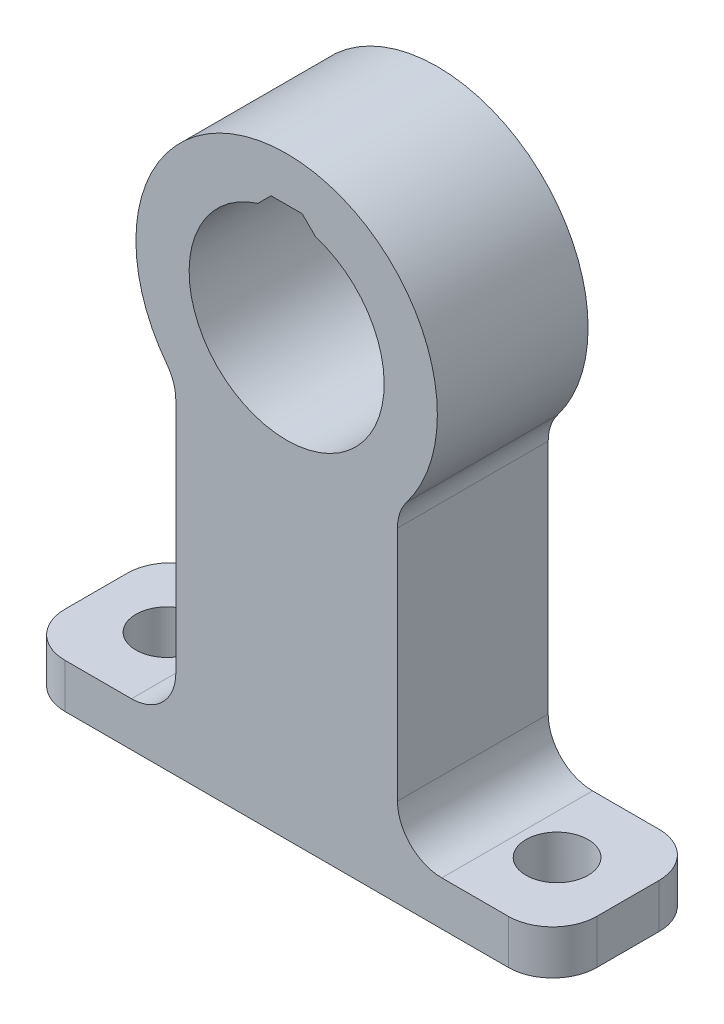
ISO-10303-21;
HEADER;
FILE_DESCRIPTION(('STEP AP214'),'2;1');
FILE_NAME('part.step','',(''),(''),'','','');
FILE_SCHEMA(('AUTOMOTIVE_DESIGN { 1 0 10303 214 1 1 1 1 }'));
ENDSEC;
DATA;
#1=APPLICATION_CONTEXT('core data for automotive mechanical design processes');
#2=APPLICATION_PROTOCOL_DEFINITION('international standard','automotive_design',2000,#1);
#3=PRODUCT_CONTEXT('',#1,'mechanical');
#4=PRODUCT('Part','Part','',(#3));
#5=PRODUCT_RELATED_PRODUCT_CATEGORY('part','',(#4));
#6=PRODUCT_DEFINITION_FORMATION('','',#4);
#7=PRODUCT_DEFINITION_CONTEXT('part definition',#1,'design');
#8=PRODUCT_DEFINITION('design','',#6,#7);
#9=PRODUCT_DEFINITION_SHAPE('','',#8);
#10=(LENGTH_UNIT() NAMED_UNIT(*) SI_UNIT(.MILLI.,.METRE.));
#11=(NAMED_UNIT(*) PLANE_ANGLE_UNIT() SI_UNIT($,.RADIAN.));
#12=(NAMED_UNIT(*) SI_UNIT($,.STERADIAN.) SOLID_ANGLE_UNIT());
#13=UNCERTAINTY_MEASURE_WITH_UNIT(LENGTH_MEASURE(1.E-05),#10,'distance_accuracy_value','');
#14=(GEOMETRIC_REPRESENTATION_CONTEXT(3) GLOBAL_UNCERTAINTY_ASSIGNED_CONTEXT((#13)) GLOBAL_UNIT_ASSIGNED_CONTEXT((#10,
#11,#12)) REPRESENTATION_CONTEXT('',''));
#15=CARTESIAN_POINT('',(0.,0.,0.));
#16=DIRECTION('',(0.,0.,1.));
#17=DIRECTION('',(1.,0.,0.));
#18=AXIS2_PLACEMENT_3D('',#15,#16,#17);
#19=CARTESIAN_POINT('',(0.,0.,17.));
#20=DIRECTION('',(0.,0.,1.));
#21=DIRECTION('',(1.,0.,0.));
#22=AXIS2_PLACEMENT_3D('',#19,#20,#21);
#23=PLANE('',#22);
#24=DIRECTION('',(1.,0.,0.));
#25=VECTOR('',#24,1.);
#26=CARTESIAN_POINT('',(30.,-50.,17.));
#27=LINE('',#26,#25);
#28=CARTESIAN_POINT('',(-25.,-50.,17.));
#29=VERTEX_POINT('',#28);
#30=CARTESIAN_POINT('',(25.,-50.,17.));
#31=VERTEX_POINT('',#30);
#32=EDGE_CURVE('E261',#29,#31,#27,.T.);
#33=ORIENTED_EDGE('',*,*,#32,.T.);
#34=DIRECTION('',(0.,1.,0.));
#35=VECTOR('',#34,1.);
#36=CARTESIAN_POINT('',(25.,-45.,17.));
#37=LINE('',#36,#35);
#38=CARTESIAN_POINT('',(25.,-45.,17.));
#39=VERTEX_POINT('',#38);
#40=EDGE_CURVE('E375',#31,#39,#37,.T.);
#41=ORIENTED_EDGE('',*,*,#40,.T.);
#42=DIRECTION('',(-1.,0.,0.));
#43=VECTOR('',#42,1.);
#44=CARTESIAN_POINT('',(12.5,-45.,17.));
#45=LINE('',#44,#43);
#46=CARTESIAN_POINT('',(17.5,-45.,17.));
#47=VERTEX_POINT('',#46);
#48=EDGE_CURVE('E240',#39,#47,#45,.T.);
#49=ORIENTED_EDGE('',*,*,#48,.T.);
#50=CARTESIAN_POINT('',(17.5,-40.,17.));
#51=DIRECTION('',(0.,0.,1.));
#52=DIRECTION('',(1.,0.,0.));
#53=AXIS2_PLACEMENT_3D('',#50,#51,#52);
#54=CIRCLE('',#53,5.);
#55=CARTESIAN_POINT('',(12.5,-40.,17.));
#56=VERTEX_POINT('',#55);
#57=EDGE_CURVE('E11',#47,#56,#54,.F.);
#58=ORIENTED_EDGE('',*,*,#57,.T.);
#59=DIRECTION('',(0.,1.,0.));
#60=VECTOR('',#59,1.);
#61=CARTESIAN_POINT('',(12.5,-11.5217186218029,17.));
#62=LINE('',#61,#60);
#63=CARTESIAN_POINT('',(12.5,-13.3322916259734,17.));
#64=VERTEX_POINT('',#63);
#65=EDGE_CURVE('E244',#56,#64,#62,.T.);
#66=ORIENTED_EDGE('',*,*,#65,.T.);
#67=CARTESIAN_POINT('',(17.5,-13.3322916259734,17.));
#68=DIRECTION('',(0.,0.,1.));
#69=DIRECTION('',(1.,0.,0.));
#70=AXIS2_PLACEMENT_3D('',#67,#68,#69);
#71=CIRCLE('',#70,5.);
#72=CARTESIAN_POINT('',(13.5227272727273,-10.3022253473431,17.));
#73=VERTEX_POINT('',#72);
#74=EDGE_CURVE('E382',#64,#73,#71,.F.);
#75=ORIENTED_EDGE('',*,*,#74,.T.);
#76=CARTESIAN_POINT('',(0.,0.,17.));
#77=DIRECTION('',(0.,0.,1.));
#78=DIRECTION('',(1.,0.,0.));
#79=AXIS2_PLACEMENT_3D('',#76,#77,#78);
#80=CIRCLE('',#79,17.);
#81=CARTESIAN_POINT('',(-13.5227272727273,-10.3022253473431,17.));
#82=VERTEX_POINT('',#81);
#83=EDGE_CURVE('E249',#73,#82,#80,.T.);
#84=ORIENTED_EDGE('',*,*,#83,.T.);
#85=CARTESIAN_POINT('',(-17.5,-13.3322916259734,17.));
#86=DIRECTION('',(0.,0.,1.));
#87=DIRECTION('',(1.,0.,0.));
#88=AXIS2_PLACEMENT_3D('',#85,#86,#87);
#89=CIRCLE('',#88,5.);
#90=CARTESIAN_POINT('',(-12.5,-13.3322916259734,17.));
#91=VERTEX_POINT('',#90);
#92=EDGE_CURVE('E388',#82,#91,#89,.F.);
#93=ORIENTED_EDGE('',*,*,#92,.T.);
#94=DIRECTION('',(0.,-1.,0.));
#95=VECTOR('',#94,1.);
#96=CARTESIAN_POINT('',(-12.5,-11.5217186218029,17.));
#97=LINE('',#96,#95);
#98=CARTESIAN_POINT('',(-12.5,-40.,17.));
#99=VERTEX_POINT('',#98);
#100=EDGE_CURVE('E253',#91,#99,#97,.T.);
#101=ORIENTED_EDGE('',*,*,#100,.T.);
#102=CARTESIAN_POINT('',(-17.5,-40.,17.));
#103=DIRECTION('',(0.,0.,1.));
#104=DIRECTION('',(1.,0.,0.));
#105=AXIS2_PLACEMENT_3D('',#102,#103,#104);
#106=CIRCLE('',#105,5.);
#107=CARTESIAN_POINT('',(-17.5,-45.,17.));
#108=VERTEX_POINT('',#107);
#109=EDGE_CURVE('E394',#99,#108,#106,.F.);
#110=ORIENTED_EDGE('',*,*,#109,.T.);
#111=DIRECTION('',(-1.,0.,0.));
#112=VECTOR('',#111,1.);
#113=CARTESIAN_POINT('',(-30.,-45.,17.));
#114=LINE('',#113,#112);
#115=CARTESIAN_POINT('',(-25.,-45.,17.));
#116=VERTEX_POINT('',#115);
#117=EDGE_CURVE('E257',#108,#116,#114,.T.);
#118=ORIENTED_EDGE('',*,*,#117,.T.);
#119=DIRECTION('',(0.,-1.,0.));
#120=VECTOR('',#119,1.);
#121=CARTESIAN_POINT('',(-25.,-50.,17.));
#122=LINE('',#121,#120);
#123=EDGE_CURVE('E371',#116,#29,#122,.T.);
#124=ORIENTED_EDGE('',*,*,#123,.T.);
#125=EDGE_LOOP('',(#33,#41,#49,#58,#66,#75,#84,#93,#101,#110,#118,#124));
#126=FACE_BOUND('',#125,.T.);
#127=DIRECTION('',(-0.707106781186546,0.707106781186549,0.));
#128=VECTOR('',#127,1.);
#129=CARTESIAN_POINT('',(1.75892477849186,12.,17.));
#130=LINE('',#129,#128);
#131=CARTESIAN_POINT('',(3.25,10.5089247784919,17.));
#132=VERTEX_POINT('',#131);
#133=CARTESIAN_POINT('',(1.75892477849186,12.,17.));
#134=VERTEX_POINT('',#133);
#135=EDGE_CURVE('E196',#132,#134,#130,.T.);
#136=ORIENTED_EDGE('',*,*,#135,.F.);
#137=CARTESIAN_POINT('',(0.,0.,17.));
#138=DIRECTION('',(0.,0.,1.));
#139=DIRECTION('',(1.,0.,0.));
#140=AXIS2_PLACEMENT_3D('',#137,#138,#139);
#141=CIRCLE('',#140,11.);
#142=CARTESIAN_POINT('',(-3.25,10.5089247784919,17.));
#143=VERTEX_POINT('',#142);
#144=EDGE_CURVE('E185',#143,#132,#141,.T.);
#145=ORIENTED_EDGE('',*,*,#144,.F.);
#146=DIRECTION('',(-0.707106781186546,-0.707106781186549,0.));
#147=VECTOR('',#146,1.);
#148=CARTESIAN_POINT('',(-3.25,10.5089247784919,17.));
#149=LINE('',#148,#147);
#150=CARTESIAN_POINT('',(-1.75892477849186,12.,17.));
#151=VERTEX_POINT('',#150);
#152=EDGE_CURVE('E214',#151,#143,#149,.T.);
#153=ORIENTED_EDGE('',*,*,#152,.F.);
#154=DIRECTION('',(-1.,0.,0.));
#155=VECTOR('',#154,1.);
#156=CARTESIAN_POINT('',(-1.75892477849186,12.,17.));
#157=LINE('',#156,#155);
#158=EDGE_CURVE('E210',#134,#151,#157,.T.);
#159=ORIENTED_EDGE('',*,*,#158,.F.);
#160=EDGE_LOOP('',(#136,#145,#153,#159));
#161=FACE_BOUND('',#160,.T.);
#162=ADVANCED_FACE('F45',(#126,#161),#23,.T.);
#163=CARTESIAN_POINT('',(0.,0.,0.));
#164=DIRECTION('',(0.,0.,1.));
#165=DIRECTION('',(1.,0.,0.));
#166=AXIS2_PLACEMENT_3D('',#163,#164,#165);
#167=PLANE('',#166);
#168=DIRECTION('',(1.,0.,0.));
#169=VECTOR('',#168,1.);
#170=CARTESIAN_POINT('',(30.,-50.,0.));
#171=LINE('',#170,#169);
#172=CARTESIAN_POINT('',(-25.,-50.,0.));
#173=VERTEX_POINT('',#172);
#174=CARTESIAN_POINT('',(25.,-50.,0.));
#175=VERTEX_POINT('',#174);
#176=EDGE_CURVE('E245',#173,#175,#171,.T.);
#177=ORIENTED_EDGE('',*,*,#176,.F.);
#178=DIRECTION('',(0.,-1.,0.));
#179=VECTOR('',#178,1.);
#180=CARTESIAN_POINT('',(-25.,0.,0.));
#181=LINE('',#180,#179);
#182=CARTESIAN_POINT('',(-25.,-45.,0.));
#183=VERTEX_POINT('',#182);
#184=EDGE_CURVE('E355',#173,#183,#181,.F.);
#185=ORIENTED_EDGE('',*,*,#184,.T.);
#186=DIRECTION('',(-1.,0.,0.));
#187=VECTOR('',#186,1.);
#188=CARTESIAN_POINT('',(-30.,-45.,0.));
#189=LINE('',#188,#187);
#190=CARTESIAN_POINT('',(-17.5,-45.,0.));
#191=VERTEX_POINT('',#190);
#192=EDGE_CURVE('E281',#191,#183,#189,.T.);
#193=ORIENTED_EDGE('',*,*,#192,.F.);
#194=CARTESIAN_POINT('',(-17.5,-40.,0.));
#195=DIRECTION('',(0.,0.,1.));
#196=DIRECTION('',(1.,0.,0.));
#197=AXIS2_PLACEMENT_3D('',#194,#195,#196);
#198=CIRCLE('',#197,5.);
#199=CARTESIAN_POINT('',(-12.5,-40.,0.));
#200=VERTEX_POINT('',#199);
#201=EDGE_CURVE('E391',#191,#200,#198,.T.);
#202=ORIENTED_EDGE('',*,*,#201,.T.);
#203=DIRECTION('',(0.,-1.,0.));
#204=VECTOR('',#203,1.);
#205=CARTESIAN_POINT('',(-12.5,-11.5217186218029,0.));
#206=LINE('',#205,#204);
#207=CARTESIAN_POINT('',(-12.5,-13.3322916259734,0.));
#208=VERTEX_POINT('',#207);
#209=EDGE_CURVE('E277',#208,#200,#206,.T.);
#210=ORIENTED_EDGE('',*,*,#209,.F.);
#211=CARTESIAN_POINT('',(-17.5,-13.3322916259734,0.));
#212=DIRECTION('',(0.,0.,1.));
#213=DIRECTION('',(1.,0.,0.));
#214=AXIS2_PLACEMENT_3D('',#211,#212,#213);
#215=CIRCLE('',#214,5.);
#216=CARTESIAN_POINT('',(-13.5227272727273,-10.3022253473431,0.));
#217=VERTEX_POINT('',#216);
#218=EDGE_CURVE('E385',#208,#217,#215,.T.);
#219=ORIENTED_EDGE('',*,*,#218,.T.);
#220=CARTESIAN_POINT('',(0.,0.,0.));
#221=DIRECTION('',(0.,0.,1.));
#222=DIRECTION('',(1.,0.,0.));
#223=AXIS2_PLACEMENT_3D('',#220,#221,#222);
#224=CIRCLE('',#223,17.);
#225=CARTESIAN_POINT('',(13.5227272727273,-10.3022253473431,0.));
#226=VERTEX_POINT('',#225);
#227=EDGE_CURVE('E273',#226,#217,#224,.T.);
#228=ORIENTED_EDGE('',*,*,#227,.F.);
#229=CARTESIAN_POINT('',(17.5,-13.3322916259734,0.));
#230=DIRECTION('',(0.,0.,1.));
#231=DIRECTION('',(1.,0.,0.));
#232=AXIS2_PLACEMENT_3D('',#229,#230,#231);
#233=CIRCLE('',#232,5.);
#234=CARTESIAN_POINT('',(12.5,-13.3322916259734,0.));
#235=VERTEX_POINT('',#234);
#236=EDGE_CURVE('E379',#226,#235,#233,.T.);
#237=ORIENTED_EDGE('',*,*,#236,.T.);
#238=DIRECTION('',(0.,1.,0.));
#239=VECTOR('',#238,1.);
#240=CARTESIAN_POINT('',(12.5,-11.5217186218029,0.));
#241=LINE('',#240,#239);
#242=CARTESIAN_POINT('',(12.5,-40.,0.));
#243=VERTEX_POINT('',#242);
#244=EDGE_CURVE('E269',#243,#235,#241,.T.);
#245=ORIENTED_EDGE('',*,*,#244,.F.);
#246=CARTESIAN_POINT('',(17.5,-40.,0.));
#247=DIRECTION('',(0.,0.,1.));
#248=DIRECTION('',(1.,0.,0.));
#249=AXIS2_PLACEMENT_3D('',#246,#247,#248);
#250=CIRCLE('',#249,5.);
#251=CARTESIAN_POINT('',(17.5,-45.,0.));
#252=VERTEX_POINT('',#251);
#253=EDGE_CURVE('E54',#243,#252,#250,.T.);
#254=ORIENTED_EDGE('',*,*,#253,.T.);
#255=DIRECTION('',(-1.,0.,0.));
#256=VECTOR('',#255,1.);
#257=CARTESIAN_POINT('',(12.5,-45.,0.));
#258=LINE('',#257,#256);
#259=CARTESIAN_POINT('',(25.,-45.,0.));
#260=VERTEX_POINT('',#259);
#261=EDGE_CURVE('E205',#260,#252,#258,.T.);
#262=ORIENTED_EDGE('',*,*,#261,.F.);
#263=DIRECTION('',(0.,1.,0.));
#264=VECTOR('',#263,1.);
#265=CARTESIAN_POINT('',(25.,0.,0.));
#266=LINE('',#265,#264);
#267=EDGE_CURVE('E352',#260,#175,#266,.F.);
#268=ORIENTED_EDGE('',*,*,#267,.T.);
#269=EDGE_LOOP('',(#177,#185,#193,#202,#210,#219,#228,#237,#245,#254,#262,#268));
#270=FACE_BOUND('',#269,.T.);
#271=CARTESIAN_POINT('',(0.,0.,0.));
#272=DIRECTION('',(0.,0.,1.));
#273=DIRECTION('',(1.,0.,0.));
#274=AXIS2_PLACEMENT_3D('',#271,#272,#273);
#275=CIRCLE('',#274,11.);
#276=CARTESIAN_POINT('',(-3.25,10.5089247784919,0.));
#277=VERTEX_POINT('',#276);
#278=CARTESIAN_POINT('',(3.25,10.5089247784919,0.));
#279=VERTEX_POINT('',#278);
#280=EDGE_CURVE('E220',#277,#279,#275,.T.);
#281=ORIENTED_EDGE('',*,*,#280,.T.);
#282=DIRECTION('',(-0.707106781186546,0.707106781186549,0.));
#283=VECTOR('',#282,1.);
#284=CARTESIAN_POINT('',(1.75892477849186,12.,0.));
#285=LINE('',#284,#283);
#286=CARTESIAN_POINT('',(1.75892477849186,12.,0.));
#287=VERTEX_POINT('',#286);
#288=EDGE_CURVE('E203',#279,#287,#285,.T.);
#289=ORIENTED_EDGE('',*,*,#288,.T.);
#290=DIRECTION('',(-1.,0.,0.));
#291=VECTOR('',#290,1.);
#292=CARTESIAN_POINT('',(-1.75892477849186,12.,0.));
#293=LINE('',#292,#291);
#294=CARTESIAN_POINT('',(-1.75892477849186,12.,0.));
#295=VERTEX_POINT('',#294);
#296=EDGE_CURVE('E226',#287,#295,#293,.T.);
#297=ORIENTED_EDGE('',*,*,#296,.T.);
#298=DIRECTION('',(-0.707106781186546,-0.707106781186549,0.));
#299=VECTOR('',#298,1.);
#300=CARTESIAN_POINT('',(-3.25,10.5089247784919,0.));
#301=LINE('',#300,#299);
#302=EDGE_CURVE('E197',#295,#277,#301,.T.);
#303=ORIENTED_EDGE('',*,*,#302,.T.);
#304=EDGE_LOOP('',(#281,#289,#297,#303));
#305=FACE_BOUND('',#304,.T.);
#306=ADVANCED_FACE('F401',(#270,#305),#167,.F.);
#307=CARTESIAN_POINT('',(12.5,-45.,17.));
#308=DIRECTION('',(0.,-1.,0.));
#309=DIRECTION('',(1.,0.,0.));
#310=AXIS2_PLACEMENT_3D('',#307,#308,#309);
#311=PLANE('',#310);
#312=CARTESIAN_POINT('',(22.,-45.,8.5));
#313=DIRECTION('',(0.,-1.,0.));
#314=DIRECTION('',(1.,0.,0.));
#315=AXIS2_PLACEMENT_3D('',#312,#313,#314);
#316=CIRCLE('',#315,3.5);
#317=CARTESIAN_POINT('',(25.5,-45.,8.5));
#318=VERTEX_POINT('',#317);
#319=EDGE_CURVE('E526',#318,#318,#316,.F.);
#320=ORIENTED_EDGE('',*,*,#319,.F.);
#321=EDGE_LOOP('',(#320));
#322=FACE_BOUND('',#321,.T.);
#323=ORIENTED_EDGE('',*,*,#261,.T.);
#324=DIRECTION('',(0.,0.,-1.));
#325=VECTOR('',#324,1.);
#326=CARTESIAN_POINT('',(17.5,-45.,17.));
#327=LINE('',#326,#325);
#328=EDGE_CURVE('E362',#252,#47,#327,.F.);
#329=ORIENTED_EDGE('',*,*,#328,.T.);
#330=ORIENTED_EDGE('',*,*,#48,.F.);
#331=CARTESIAN_POINT('',(25.,-45.,12.));
#332=DIRECTION('',(0.,-1.,0.));
#333=DIRECTION('',(1.,0.,0.));
#334=AXIS2_PLACEMENT_3D('',#331,#332,#333);
#335=CIRCLE('',#334,5.);
#336=CARTESIAN_POINT('',(30.,-45.,12.));
#337=VERTEX_POINT('',#336);
#338=EDGE_CURVE('E69',#39,#337,#335,.F.);
#339=ORIENTED_EDGE('',*,*,#338,.T.);
#340=DIRECTION('',(0.,0.,-1.));
#341=VECTOR('',#340,1.);
#342=CARTESIAN_POINT('',(30.,-45.,17.));
#343=LINE('',#342,#341);
#344=CARTESIAN_POINT('',(30.,-45.,5.));
#345=VERTEX_POINT('',#344);
#346=EDGE_CURVE('E265',#337,#345,#343,.T.);
#347=ORIENTED_EDGE('',*,*,#346,.T.);
#348=CARTESIAN_POINT('',(25.,-45.,5.));
#349=DIRECTION('',(0.,-1.,0.));
#350=DIRECTION('',(1.,0.,0.));
#351=AXIS2_PLACEMENT_3D('',#348,#349,#350);
#352=CIRCLE('',#351,5.);
#353=EDGE_CURVE('E61',#345,#260,#352,.F.);
#354=ORIENTED_EDGE('',*,*,#353,.T.);
#355=EDGE_LOOP('',(#323,#329,#330,#339,#347,#354));
#356=FACE_BOUND('',#355,.T.);
#357=ADVANCED_FACE('F406',(#322,#356),#311,.F.);
#358=CARTESIAN_POINT('',(12.5,-11.5217186218029,17.));
#359=DIRECTION('',(-1.,0.,0.));
#360=DIRECTION('',(0.,0.,1.));
#361=AXIS2_PLACEMENT_3D('',#358,#359,#360);
#362=PLANE('',#361);
#363=ORIENTED_EDGE('',*,*,#244,.T.);
#364=DIRECTION('',(0.,0.,1.));
#365=VECTOR('',#364,1.);
#366=CARTESIAN_POINT('',(12.5,-13.3322916259734,17.));
#367=LINE('',#366,#365);
#368=EDGE_CURVE('E313',#235,#64,#367,.T.);
#369=ORIENTED_EDGE('',*,*,#368,.T.);
#370=ORIENTED_EDGE('',*,*,#65,.F.);
#371=DIRECTION('',(0.,0.,-1.));
#372=VECTOR('',#371,1.);
#373=CARTESIAN_POINT('',(12.5,-40.,0.));
#374=LINE('',#373,#372);
#375=EDGE_CURVE('E309',#56,#243,#374,.T.);
#376=ORIENTED_EDGE('',*,*,#375,.T.);
#377=EDGE_LOOP('',(#363,#369,#370,#376));
#378=FACE_BOUND('',#377,.T.);
#379=ADVANCED_FACE('F413',(#378),#362,.F.);
#380=CARTESIAN_POINT('',(0.,0.,17.));
#381=DIRECTION('',(0.,0.,-1.));
#382=DIRECTION('',(-1.,0.,0.));
#383=AXIS2_PLACEMENT_3D('',#380,#381,#382);
#384=CYLINDRICAL_SURFACE('',#383,17.);
#385=ORIENTED_EDGE('',*,*,#83,.F.);
#386=DIRECTION('',(0.,0.,-1.));
#387=VECTOR('',#386,1.);
#388=CARTESIAN_POINT('',(13.5227272727273,-10.3022253473431,17.));
#389=LINE('',#388,#387);
#390=EDGE_CURVE('E305',#73,#226,#389,.T.);
#391=ORIENTED_EDGE('',*,*,#390,.T.);
#392=ORIENTED_EDGE('',*,*,#227,.T.);
#393=DIRECTION('',(0.,0.,-1.));
#394=VECTOR('',#393,1.);
#395=CARTESIAN_POINT('',(-13.5227272727273,-10.3022253473431,17.));
#396=LINE('',#395,#394);
#397=EDGE_CURVE('E302',#217,#82,#396,.F.);
#398=ORIENTED_EDGE('',*,*,#397,.T.);
#399=EDGE_LOOP('',(#385,#391,#392,#398));
#400=FACE_BOUND('',#399,.T.);
#401=ADVANCED_FACE('F421',(#400),#384,.T.);
#402=CARTESIAN_POINT('',(-12.5,-11.5217186218029,17.));
#403=DIRECTION('',(1.,0.,0.));
#404=DIRECTION('',(0.,0.,-1.));
#405=AXIS2_PLACEMENT_3D('',#402,#403,#404);
#406=PLANE('',#405);
#407=ORIENTED_EDGE('',*,*,#100,.F.);
#408=DIRECTION('',(0.,0.,1.));
#409=VECTOR('',#408,1.);
#410=CARTESIAN_POINT('',(-12.5,-13.3322916259734,0.));
#411=LINE('',#410,#409);
#412=EDGE_CURVE('E319',#91,#208,#411,.F.);
#413=ORIENTED_EDGE('',*,*,#412,.T.);
#414=ORIENTED_EDGE('',*,*,#209,.T.);
#415=DIRECTION('',(0.,0.,-1.));
#416=VECTOR('',#415,1.);
#417=CARTESIAN_POINT('',(-12.5,-40.,17.));
#418=LINE('',#417,#416);
#419=EDGE_CURVE('E316',#200,#99,#418,.F.);
#420=ORIENTED_EDGE('',*,*,#419,.T.);
#421=EDGE_LOOP('',(#407,#413,#414,#420));
#422=FACE_BOUND('',#421,.T.);
#423=ADVANCED_FACE('F430',(#422),#406,.F.);
#424=CARTESIAN_POINT('',(-30.,-45.,17.));
#425=DIRECTION('',(0.,-1.,0.));
#426=DIRECTION('',(1.,0.,0.));
#427=AXIS2_PLACEMENT_3D('',#424,#425,#426);
#428=PLANE('',#427);
#429=CARTESIAN_POINT('',(-22.,-45.,8.5));
#430=DIRECTION('',(0.,-1.,0.));
#431=DIRECTION('',(1.,0.,0.));
#432=AXIS2_PLACEMENT_3D('',#429,#430,#431);
#433=CIRCLE('',#432,3.5);
#434=CARTESIAN_POINT('',(-18.5,-45.,8.5));
#435=VERTEX_POINT('',#434);
#436=EDGE_CURVE('E223',#435,#435,#433,.F.);
#437=ORIENTED_EDGE('',*,*,#436,.F.);
#438=EDGE_LOOP('',(#437));
#439=FACE_BOUND('',#438,.T.);
#440=ORIENTED_EDGE('',*,*,#117,.F.);
#441=DIRECTION('',(0.,0.,-1.));
#442=VECTOR('',#441,1.);
#443=CARTESIAN_POINT('',(-17.5,-45.,0.));
#444=LINE('',#443,#442);
#445=EDGE_CURVE('E329',#108,#191,#444,.T.);
#446=ORIENTED_EDGE('',*,*,#445,.T.);
#447=ORIENTED_EDGE('',*,*,#192,.T.);
#448=CARTESIAN_POINT('',(-25.,-45.,5.));
#449=DIRECTION('',(0.,-1.,0.));
#450=DIRECTION('',(1.,0.,0.));
#451=AXIS2_PLACEMENT_3D('',#448,#449,#450);
#452=CIRCLE('',#451,5.);
#453=CARTESIAN_POINT('',(-30.,-45.,5.));
#454=VERTEX_POINT('',#453);
#455=EDGE_CURVE('E326',#183,#454,#452,.F.);
#456=ORIENTED_EDGE('',*,*,#455,.T.);
#457=DIRECTION('',(0.,0.,-1.));
#458=VECTOR('',#457,1.);
#459=CARTESIAN_POINT('',(-30.,-45.,17.));
#460=LINE('',#459,#458);
#461=CARTESIAN_POINT('',(-30.,-45.,12.));
#462=VERTEX_POINT('',#461);
#463=EDGE_CURVE('E298',#462,#454,#460,.T.);
#464=ORIENTED_EDGE('',*,*,#463,.F.);
#465=CARTESIAN_POINT('',(-25.,-45.,12.));
#466=DIRECTION('',(0.,-1.,0.));
#467=DIRECTION('',(1.,0.,0.));
#468=AXIS2_PLACEMENT_3D('',#465,#466,#467);
#469=CIRCLE('',#468,5.);
#470=EDGE_CURVE('E323',#462,#116,#469,.F.);
#471=ORIENTED_EDGE('',*,*,#470,.T.);
#472=EDGE_LOOP('',(#440,#446,#447,#456,#464,#471));
#473=FACE_BOUND('',#472,.T.);
#474=ADVANCED_FACE('F439',(#439,#473),#428,.F.);
#475=CARTESIAN_POINT('',(-30.,-50.,17.));
#476=DIRECTION('',(1.,0.,0.));
#477=DIRECTION('',(0.,0.,-1.));
#478=AXIS2_PLACEMENT_3D('',#475,#476,#477);
#479=PLANE('',#478);
#480=ORIENTED_EDGE('',*,*,#463,.T.);
#481=DIRECTION('',(0.,-1.,0.));
#482=VECTOR('',#481,1.);
#483=CARTESIAN_POINT('',(-30.,-50.,5.));
#484=LINE('',#483,#482);
#485=CARTESIAN_POINT('',(-30.,-50.,5.));
#486=VERTEX_POINT('',#485);
#487=EDGE_CURVE('E336',#454,#486,#484,.T.);
#488=ORIENTED_EDGE('',*,*,#487,.T.);
#489=DIRECTION('',(0.,0.,-1.));
#490=VECTOR('',#489,1.);
#491=CARTESIAN_POINT('',(-30.,-50.,17.));
#492=LINE('',#491,#490);
#493=CARTESIAN_POINT('',(-30.,-50.,12.));
#494=VERTEX_POINT('',#493);
#495=EDGE_CURVE('E294',#494,#486,#492,.T.);
#496=ORIENTED_EDGE('',*,*,#495,.F.);
#497=DIRECTION('',(0.,-1.,0.));
#498=VECTOR('',#497,1.);
#499=CARTESIAN_POINT('',(-30.,-45.,12.));
#500=LINE('',#499,#498);
#501=EDGE_CURVE('E333',#494,#462,#500,.F.);
#502=ORIENTED_EDGE('',*,*,#501,.T.);
#503=EDGE_LOOP('',(#480,#488,#496,#502));
#504=FACE_BOUND('',#503,.T.);
#505=ADVANCED_FACE('F465',(#504),#479,.F.);
#506=CARTESIAN_POINT('',(30.,-50.,17.));
#507=DIRECTION('',(0.,1.,0.));
#508=DIRECTION('',(0.,0.,1.));
#509=AXIS2_PLACEMENT_3D('',#506,#507,#508);
#510=PLANE('',#509);
#511=CARTESIAN_POINT('',(-22.,-50.,8.5));
#512=DIRECTION('',(0.,-1.,0.));
#513=DIRECTION('',(0.,0.,-1.));
#514=AXIS2_PLACEMENT_3D('',#511,#512,#513);
#515=CIRCLE('',#514,3.5);
#516=CARTESIAN_POINT('',(-22.,-50.,5.));
#517=VERTEX_POINT('',#516);
#518=EDGE_CURVE('E517',#517,#517,#515,.T.);
#519=ORIENTED_EDGE('',*,*,#518,.F.);
#520=EDGE_LOOP('',(#519));
#521=FACE_BOUND('',#520,.T.);
#522=CARTESIAN_POINT('',(22.,-50.,8.5));
#523=DIRECTION('',(0.,-1.,0.));
#524=DIRECTION('',(0.,0.,1.));
#525=AXIS2_PLACEMENT_3D('',#522,#523,#524);
#526=CIRCLE('',#525,3.5);
#527=CARTESIAN_POINT('',(22.,-50.,12.));
#528=VERTEX_POINT('',#527);
#529=EDGE_CURVE('E523',#528,#528,#526,.T.);
#530=ORIENTED_EDGE('',*,*,#529,.F.);
#531=EDGE_LOOP('',(#530));
#532=FACE_BOUND('',#531,.T.);
#533=ORIENTED_EDGE('',*,*,#495,.T.);
#534=CARTESIAN_POINT('',(-25.,-50.,5.));
#535=DIRECTION('',(0.,1.,0.));
#536=DIRECTION('',(0.,0.,1.));
#537=AXIS2_PLACEMENT_3D('',#534,#535,#536);
#538=CIRCLE('',#537,5.);
#539=EDGE_CURVE('E349',#486,#173,#538,.F.);
#540=ORIENTED_EDGE('',*,*,#539,.T.);
#541=ORIENTED_EDGE('',*,*,#176,.T.);
#542=CARTESIAN_POINT('',(25.,-50.,5.));
#543=DIRECTION('',(0.,1.,0.));
#544=DIRECTION('',(0.,0.,1.));
#545=AXIS2_PLACEMENT_3D('',#542,#543,#544);
#546=CIRCLE('',#545,5.);
#547=CARTESIAN_POINT('',(30.,-50.,5.));
#548=VERTEX_POINT('',#547);
#549=EDGE_CURVE('E346',#175,#548,#546,.F.);
#550=ORIENTED_EDGE('',*,*,#549,.T.);
#551=DIRECTION('',(0.,0.,-1.));
#552=VECTOR('',#551,1.);
#553=CARTESIAN_POINT('',(30.,-50.,17.));
#554=LINE('',#553,#552);
#555=CARTESIAN_POINT('',(30.,-50.,12.));
#556=VERTEX_POINT('',#555);
#557=EDGE_CURVE('E290',#556,#548,#554,.T.);
#558=ORIENTED_EDGE('',*,*,#557,.F.);
#559=CARTESIAN_POINT('',(25.,-50.,12.));
#560=DIRECTION('',(0.,1.,0.));
#561=DIRECTION('',(0.,0.,1.));
#562=AXIS2_PLACEMENT_3D('',#559,#560,#561);
#563=CIRCLE('',#562,5.);
#564=EDGE_CURVE('E343',#556,#31,#563,.F.);
#565=ORIENTED_EDGE('',*,*,#564,.T.);
#566=ORIENTED_EDGE('',*,*,#32,.F.);
#567=CARTESIAN_POINT('',(-25.,-50.,12.));
#568=DIRECTION('',(0.,1.,0.));
#569=DIRECTION('',(0.,0.,1.));
#570=AXIS2_PLACEMENT_3D('',#567,#568,#569);
#571=CIRCLE('',#570,5.);
#572=EDGE_CURVE('E340',#29,#494,#571,.F.);
#573=ORIENTED_EDGE('',*,*,#572,.T.);
#574=EDGE_LOOP('',(#533,#540,#541,#550,#558,#565,#566,#573));
#575=FACE_BOUND('',#574,.T.);
#576=ADVANCED_FACE('F448',(#521,#532,#575),#510,.F.);
#577=CARTESIAN_POINT('',(30.,-45.,17.));
#578=DIRECTION('',(-1.,0.,0.));
#579=DIRECTION('',(0.,0.,1.));
#580=AXIS2_PLACEMENT_3D('',#577,#578,#579);
#581=PLANE('',#580);
#582=ORIENTED_EDGE('',*,*,#557,.T.);
#583=DIRECTION('',(0.,1.,0.));
#584=VECTOR('',#583,1.);
#585=CARTESIAN_POINT('',(30.,-45.,5.));
#586=LINE('',#585,#584);
#587=EDGE_CURVE('E368',#548,#345,#586,.T.);
#588=ORIENTED_EDGE('',*,*,#587,.T.);
#589=ORIENTED_EDGE('',*,*,#346,.F.);
#590=DIRECTION('',(0.,1.,0.));
#591=VECTOR('',#590,1.);
#592=CARTESIAN_POINT('',(30.,-50.,12.));
#593=LINE('',#592,#591);
#594=EDGE_CURVE('E365',#337,#556,#593,.F.);
#595=ORIENTED_EDGE('',*,*,#594,.T.);
#596=EDGE_LOOP('',(#582,#588,#589,#595));
#597=FACE_BOUND('',#596,.T.);
#598=ADVANCED_FACE('F456',(#597),#581,.F.);
#599=CARTESIAN_POINT('',(0.,0.,17.));
#600=DIRECTION('',(0.,0.,-1.));
#601=DIRECTION('',(-1.,0.,0.));
#602=AXIS2_PLACEMENT_3D('',#599,#600,#601);
#603=CYLINDRICAL_SURFACE('',#602,11.);
#604=ORIENTED_EDGE('',*,*,#280,.F.);
#605=DIRECTION('',(0.,0.,-1.));
#606=VECTOR('',#605,1.);
#607=CARTESIAN_POINT('',(-3.25,10.5089247784919,17.));
#608=LINE('',#607,#606);
#609=EDGE_CURVE('E191',#143,#277,#608,.T.);
#610=ORIENTED_EDGE('',*,*,#609,.F.);
#611=ORIENTED_EDGE('',*,*,#144,.T.);
#612=DIRECTION('',(0.,0.,-1.));
#613=VECTOR('',#612,1.);
#614=CARTESIAN_POINT('',(3.25,10.5089247784919,17.));
#615=LINE('',#614,#613);
#616=EDGE_CURVE('E188',#132,#279,#615,.T.);
#617=ORIENTED_EDGE('',*,*,#616,.T.);
#618=EDGE_LOOP('',(#604,#610,#611,#617));
#619=FACE_BOUND('',#618,.T.);
#620=ADVANCED_FACE('F187',(#619),#603,.F.);
#621=CARTESIAN_POINT('',(1.75892477849186,12.,17.));
#622=DIRECTION('',(-0.707106781186549,-0.707106781186546,0.));
#623=DIRECTION('',(0.707106781186546,-0.707106781186549,0.));
#624=AXIS2_PLACEMENT_3D('',#621,#622,#623);
#625=PLANE('',#624);
#626=ORIENTED_EDGE('',*,*,#288,.F.);
#627=ORIENTED_EDGE('',*,*,#616,.F.);
#628=ORIENTED_EDGE('',*,*,#135,.T.);
#629=DIRECTION('',(0.,0.,-1.));
#630=VECTOR('',#629,1.);
#631=CARTESIAN_POINT('',(1.75892477849186,12.,17.));
#632=LINE('',#631,#630);
#633=EDGE_CURVE('E206',#134,#287,#632,.T.);
#634=ORIENTED_EDGE('',*,*,#633,.T.);
#635=EDGE_LOOP('',(#626,#627,#628,#634));
#636=FACE_BOUND('',#635,.T.);
#637=ADVANCED_FACE('F200',(#636),#625,.T.);
#638=CARTESIAN_POINT('',(-1.75892477849186,12.,17.));
#639=DIRECTION('',(0.,-1.,0.));
#640=DIRECTION('',(0.,0.,-1.));
#641=AXIS2_PLACEMENT_3D('',#638,#639,#640);
#642=PLANE('',#641);
#643=ORIENTED_EDGE('',*,*,#296,.F.);
#644=ORIENTED_EDGE('',*,*,#633,.F.);
#645=ORIENTED_EDGE('',*,*,#158,.T.);
#646=DIRECTION('',(0.,0.,-1.));
#647=VECTOR('',#646,1.);
#648=CARTESIAN_POINT('',(-1.75892477849186,12.,17.));
#649=LINE('',#648,#647);
#650=EDGE_CURVE('E235',#151,#295,#649,.T.);
#651=ORIENTED_EDGE('',*,*,#650,.T.);
#652=EDGE_LOOP('',(#643,#644,#645,#651));
#653=FACE_BOUND('',#652,.T.);
#654=ADVANCED_FACE('F494',(#653),#642,.T.);
#655=CARTESIAN_POINT('',(-3.25,10.5089247784919,17.));
#656=DIRECTION('',(0.707106781186549,-0.707106781186546,0.));
#657=DIRECTION('',(0.707106781186546,0.707106781186549,0.));
#658=AXIS2_PLACEMENT_3D('',#655,#656,#657);
#659=PLANE('',#658);
#660=ORIENTED_EDGE('',*,*,#302,.F.);
#661=ORIENTED_EDGE('',*,*,#650,.F.);
#662=ORIENTED_EDGE('',*,*,#152,.T.);
#663=ORIENTED_EDGE('',*,*,#609,.T.);
#664=EDGE_LOOP('',(#660,#661,#662,#663));
#665=FACE_BOUND('',#664,.T.);
#666=ADVANCED_FACE('F498',(#665),#659,.T.);
#667=CARTESIAN_POINT('',(22.,17.001,8.5));
#668=DIRECTION('',(0.,-1.,0.));
#669=DIRECTION('',(0.,0.,-1.));
#670=AXIS2_PLACEMENT_3D('',#667,#668,#669);
#671=CYLINDRICAL_SURFACE('',#670,3.5);
#672=ORIENTED_EDGE('',*,*,#529,.T.);
#673=EDGE_LOOP('',(#672));
#674=FACE_BOUND('',#673,.T.);
#675=ORIENTED_EDGE('',*,*,#319,.T.);
#676=EDGE_LOOP('',(#675));
#677=FACE_BOUND('',#676,.T.);
#678=ADVANCED_FACE('F504',(#674,#677),#671,.F.);
#679=CARTESIAN_POINT('',(-22.,17.001,8.5));
#680=DIRECTION('',(0.,-1.,0.));
#681=DIRECTION('',(0.,0.,-1.));
#682=AXIS2_PLACEMENT_3D('',#679,#680,#681);
#683=CYLINDRICAL_SURFACE('',#682,3.5);
#684=ORIENTED_EDGE('',*,*,#518,.T.);
#685=EDGE_LOOP('',(#684));
#686=FACE_BOUND('',#685,.T.);
#687=ORIENTED_EDGE('',*,*,#436,.T.);
#688=EDGE_LOOP('',(#687));
#689=FACE_BOUND('',#688,.T.);
#690=ADVANCED_FACE('F508',(#686,#689),#683,.F.);
#691=CARTESIAN_POINT('',(17.5,-13.3322916259734,17.));
#692=DIRECTION('',(0.,0.,-1.));
#693=DIRECTION('',(-1.,0.,0.));
#694=AXIS2_PLACEMENT_3D('',#691,#692,#693);
#695=CYLINDRICAL_SURFACE('',#694,5.);
#696=ORIENTED_EDGE('',*,*,#74,.F.);
#697=ORIENTED_EDGE('',*,*,#368,.F.);
#698=ORIENTED_EDGE('',*,*,#236,.F.);
#699=ORIENTED_EDGE('',*,*,#390,.F.);
#700=EDGE_LOOP('',(#696,#697,#698,#699));
#701=FACE_BOUND('',#700,.T.);
#702=ADVANCED_FACE('F416',(#701),#695,.F.);
#703=CARTESIAN_POINT('',(-17.5,-13.3322916259734,17.));
#704=DIRECTION('',(0.,0.,-1.));
#705=DIRECTION('',(-1.,0.,0.));
#706=AXIS2_PLACEMENT_3D('',#703,#704,#705);
#707=CYLINDRICAL_SURFACE('',#706,5.);
#708=ORIENTED_EDGE('',*,*,#92,.F.);
#709=ORIENTED_EDGE('',*,*,#397,.F.);
#710=ORIENTED_EDGE('',*,*,#218,.F.);
#711=ORIENTED_EDGE('',*,*,#412,.F.);
#712=EDGE_LOOP('',(#708,#709,#710,#711));
#713=FACE_BOUND('',#712,.T.);
#714=ADVANCED_FACE('F425',(#713),#707,.F.);
#715=CARTESIAN_POINT('',(-17.5,-40.,17.));
#716=DIRECTION('',(0.,0.,1.));
#717=DIRECTION('',(1.,0.,0.));
#718=AXIS2_PLACEMENT_3D('',#715,#716,#717);
#719=CYLINDRICAL_SURFACE('',#718,5.);
#720=ORIENTED_EDGE('',*,*,#109,.F.);
#721=ORIENTED_EDGE('',*,*,#419,.F.);
#722=ORIENTED_EDGE('',*,*,#201,.F.);
#723=ORIENTED_EDGE('',*,*,#445,.F.);
#724=EDGE_LOOP('',(#720,#721,#722,#723));
#725=FACE_BOUND('',#724,.T.);
#726=ADVANCED_FACE('F434',(#725),#719,.F.);
#727=CARTESIAN_POINT('',(-25.,-50.,5.));
#728=DIRECTION('',(0.,-1.,0.));
#729=DIRECTION('',(0.,0.,-1.));
#730=AXIS2_PLACEMENT_3D('',#727,#728,#729);
#731=CYLINDRICAL_SURFACE('',#730,5.);
#732=ORIENTED_EDGE('',*,*,#455,.F.);
#733=ORIENTED_EDGE('',*,*,#184,.F.);
#734=ORIENTED_EDGE('',*,*,#539,.F.);
#735=ORIENTED_EDGE('',*,*,#487,.F.);
#736=EDGE_LOOP('',(#732,#733,#734,#735));
#737=FACE_BOUND('',#736,.T.);
#738=ADVANCED_FACE('F462',(#737),#731,.T.);
#739=CARTESIAN_POINT('',(17.5,-40.,17.));
#740=DIRECTION('',(0.,0.,1.));
#741=DIRECTION('',(1.,0.,0.));
#742=AXIS2_PLACEMENT_3D('',#739,#740,#741);
#743=CYLINDRICAL_SURFACE('',#742,5.);
#744=ORIENTED_EDGE('',*,*,#57,.F.);
#745=ORIENTED_EDGE('',*,*,#328,.F.);
#746=ORIENTED_EDGE('',*,*,#253,.F.);
#747=ORIENTED_EDGE('',*,*,#375,.F.);
#748=EDGE_LOOP('',(#744,#745,#746,#747));
#749=FACE_BOUND('',#748,.T.);
#750=ADVANCED_FACE('F408',(#749),#743,.F.);
#751=CARTESIAN_POINT('',(25.,-45.,5.));
#752=DIRECTION('',(0.,1.,0.));
#753=DIRECTION('',(0.,0.,1.));
#754=AXIS2_PLACEMENT_3D('',#751,#752,#753);
#755=CYLINDRICAL_SURFACE('',#754,5.);
#756=ORIENTED_EDGE('',*,*,#549,.F.);
#757=ORIENTED_EDGE('',*,*,#267,.F.);
#758=ORIENTED_EDGE('',*,*,#353,.F.);
#759=ORIENTED_EDGE('',*,*,#587,.F.);
#760=EDGE_LOOP('',(#756,#757,#758,#759));
#761=FACE_BOUND('',#760,.T.);
#762=ADVANCED_FACE('F458',(#761),#755,.T.);
#763=CARTESIAN_POINT('',(25.,0.,12.));
#764=DIRECTION('',(0.,-1.,0.));
#765=DIRECTION('',(0.,0.,-1.));
#766=AXIS2_PLACEMENT_3D('',#763,#764,#765);
#767=CYLINDRICAL_SURFACE('',#766,5.);
#768=ORIENTED_EDGE('',*,*,#564,.F.);
#769=ORIENTED_EDGE('',*,*,#594,.F.);
#770=ORIENTED_EDGE('',*,*,#338,.F.);
#771=ORIENTED_EDGE('',*,*,#40,.F.);
#772=EDGE_LOOP('',(#768,#769,#770,#771));
#773=FACE_BOUND('',#772,.T.);
#774=ADVANCED_FACE('F454',(#773),#767,.T.);
#775=CARTESIAN_POINT('',(-25.,0.,12.));
#776=DIRECTION('',(0.,1.,0.));
#777=DIRECTION('',(0.,0.,1.));
#778=AXIS2_PLACEMENT_3D('',#775,#776,#777);
#779=CYLINDRICAL_SURFACE('',#778,5.);
#780=ORIENTED_EDGE('',*,*,#470,.F.);
#781=ORIENTED_EDGE('',*,*,#501,.F.);
#782=ORIENTED_EDGE('',*,*,#572,.F.);
#783=ORIENTED_EDGE('',*,*,#123,.F.);
#784=EDGE_LOOP('',(#780,#781,#782,#783));
#785=FACE_BOUND('',#784,.T.);
#786=ADVANCED_FACE('F47',(#785),#779,.T.);
#787=CLOSED_SHELL('',(#162,#306,#357,#379,#401,#423,#474,#505,#576,#598,#620,#637,#654,#666,
#678,#690,#702,#714,#726,#738,#750,#762,#774,#786));
#788=MANIFOLD_SOLID_BREP('B2',#787);
#789=ADVANCED_BREP_SHAPE_REPRESENTATION('',(#18,#788),#14);
#790=SHAPE_DEFINITION_REPRESENTATION(#9,#789);
ENDSEC;
END-ISO-10303-21;
